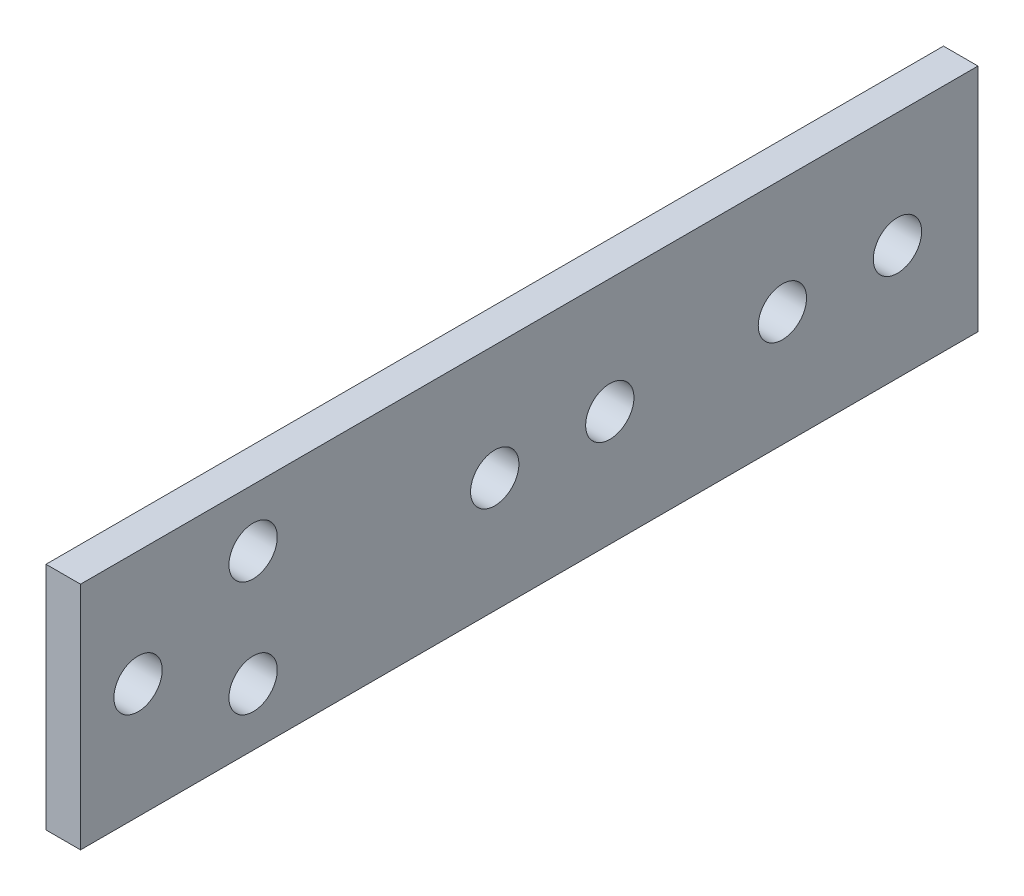
ISO-10303-21;
HEADER;
FILE_DESCRIPTION(('STEP AP214'),'2;1');
FILE_NAME('part.step','',(''),(''),'','','');
FILE_SCHEMA(('AUTOMOTIVE_DESIGN { 1 0 10303 214 1 1 1 1 }'));
ENDSEC;
DATA;
#1=APPLICATION_CONTEXT('core data for automotive mechanical design processes');
#2=APPLICATION_PROTOCOL_DEFINITION('international standard','automotive_design',2000,#1);
#3=PRODUCT_CONTEXT('',#1,'mechanical');
#4=PRODUCT('Part','Part','',(#3));
#5=PRODUCT_RELATED_PRODUCT_CATEGORY('part','',(#4));
#6=PRODUCT_DEFINITION_FORMATION('','',#4);
#7=PRODUCT_DEFINITION_CONTEXT('part definition',#1,'design');
#8=PRODUCT_DEFINITION('design','',#6,#7);
#9=PRODUCT_DEFINITION_SHAPE('','',#8);
#10=(LENGTH_UNIT() NAMED_UNIT(*) SI_UNIT(.MILLI.,.METRE.));
#11=(NAMED_UNIT(*) PLANE_ANGLE_UNIT() SI_UNIT($,.RADIAN.));
#12=(NAMED_UNIT(*) SI_UNIT($,.STERADIAN.) SOLID_ANGLE_UNIT());
#13=UNCERTAINTY_MEASURE_WITH_UNIT(LENGTH_MEASURE(1.E-05),#10,'distance_accuracy_value','');
#14=(GEOMETRIC_REPRESENTATION_CONTEXT(3) GLOBAL_UNCERTAINTY_ASSIGNED_CONTEXT((#13)) GLOBAL_UNIT_ASSIGNED_CONTEXT((#10,
#11,#12)) REPRESENTATION_CONTEXT('',''));
#15=CARTESIAN_POINT('',(0.,0.,0.));
#16=DIRECTION('',(0.,0.,1.));
#17=DIRECTION('',(1.,0.,0.));
#18=AXIS2_PLACEMENT_3D('',#15,#16,#17);
#19=CARTESIAN_POINT('',(33.,-80.,-58.));
#20=DIRECTION('',(0.,0.,-1.));
#21=DIRECTION('',(-1.,0.,0.));
#22=AXIS2_PLACEMENT_3D('',#19,#20,#21);
#23=PLANE('',#22);
#24=DIRECTION('',(0.,1.,0.));
#25=VECTOR('',#24,1.);
#26=CARTESIAN_POINT('',(36.,-80.,-58.));
#27=LINE('',#26,#25);
#28=CARTESIAN_POINT('',(36.,-80.,-58.));
#29=VERTEX_POINT('',#28);
#30=CARTESIAN_POINT('',(36.,-60.,-58.));
#31=VERTEX_POINT('',#30);
#32=EDGE_CURVE('E97',#29,#31,#27,.T.);
#33=ORIENTED_EDGE('',*,*,#32,.F.);
#34=DIRECTION('',(1.,0.,0.));
#35=VECTOR('',#34,1.);
#36=CARTESIAN_POINT('',(33.,-80.,-58.));
#37=LINE('',#36,#35);
#38=CARTESIAN_POINT('',(33.,-80.,-58.));
#39=VERTEX_POINT('',#38);
#40=EDGE_CURVE('E11',#39,#29,#37,.T.);
#41=ORIENTED_EDGE('',*,*,#40,.F.);
#42=DIRECTION('',(0.,1.,0.));
#43=VECTOR('',#42,1.);
#44=CARTESIAN_POINT('',(33.,-80.,-58.));
#45=LINE('',#44,#43);
#46=CARTESIAN_POINT('',(33.,-60.,-58.));
#47=VERTEX_POINT('',#46);
#48=EDGE_CURVE('E90',#39,#47,#45,.T.);
#49=ORIENTED_EDGE('',*,*,#48,.T.);
#50=DIRECTION('',(1.,0.,0.));
#51=VECTOR('',#50,1.);
#52=CARTESIAN_POINT('',(33.,-60.,-58.));
#53=LINE('',#52,#51);
#54=EDGE_CURVE('E35',#47,#31,#53,.T.);
#55=ORIENTED_EDGE('',*,*,#54,.T.);
#56=EDGE_LOOP('',(#33,#41,#49,#55));
#57=FACE_BOUND('',#56,.T.);
#58=ADVANCED_FACE('F32',(#57),#23,.T.);
#59=CARTESIAN_POINT('',(33.,-80.,20.));
#60=DIRECTION('',(0.,-1.,0.));
#61=DIRECTION('',(0.,0.,-1.));
#62=AXIS2_PLACEMENT_3D('',#59,#60,#61);
#63=PLANE('',#62);
#64=DIRECTION('',(0.,0.,-1.));
#65=VECTOR('',#64,1.);
#66=CARTESIAN_POINT('',(36.,-80.,20.));
#67=LINE('',#66,#65);
#68=CARTESIAN_POINT('',(36.,-80.,20.));
#69=VERTEX_POINT('',#68);
#70=EDGE_CURVE('E92',#69,#29,#67,.T.);
#71=ORIENTED_EDGE('',*,*,#70,.F.);
#72=DIRECTION('',(1.,0.,0.));
#73=VECTOR('',#72,1.);
#74=CARTESIAN_POINT('',(33.,-80.,20.));
#75=LINE('',#74,#73);
#76=CARTESIAN_POINT('',(33.,-80.,20.));
#77=VERTEX_POINT('',#76);
#78=EDGE_CURVE('E41',#77,#69,#75,.T.);
#79=ORIENTED_EDGE('',*,*,#78,.F.);
#80=DIRECTION('',(0.,0.,-1.));
#81=VECTOR('',#80,1.);
#82=CARTESIAN_POINT('',(33.,-80.,20.));
#83=LINE('',#82,#81);
#84=EDGE_CURVE('E87',#77,#39,#83,.T.);
#85=ORIENTED_EDGE('',*,*,#84,.T.);
#86=ORIENTED_EDGE('',*,*,#40,.T.);
#87=EDGE_LOOP('',(#71,#79,#85,#86));
#88=FACE_BOUND('',#87,.T.);
#89=ADVANCED_FACE('F108',(#88),#63,.T.);
#90=CARTESIAN_POINT('',(33.,-60.,20.));
#91=DIRECTION('',(0.,0.,1.));
#92=DIRECTION('',(1.,0.,0.));
#93=AXIS2_PLACEMENT_3D('',#90,#91,#92);
#94=PLANE('',#93);
#95=DIRECTION('',(0.,-1.,0.));
#96=VECTOR('',#95,1.);
#97=CARTESIAN_POINT('',(36.,-60.,20.));
#98=LINE('',#97,#96);
#99=CARTESIAN_POINT('',(36.,-60.,20.));
#100=VERTEX_POINT('',#99);
#101=EDGE_CURVE('E82',#100,#69,#98,.T.);
#102=ORIENTED_EDGE('',*,*,#101,.F.);
#103=DIRECTION('',(1.,0.,0.));
#104=VECTOR('',#103,1.);
#105=CARTESIAN_POINT('',(33.,-60.,20.));
#106=LINE('',#105,#104);
#107=CARTESIAN_POINT('',(33.,-60.,20.));
#108=VERTEX_POINT('',#107);
#109=EDGE_CURVE('E77',#108,#100,#106,.T.);
#110=ORIENTED_EDGE('',*,*,#109,.F.);
#111=DIRECTION('',(0.,-1.,0.));
#112=VECTOR('',#111,1.);
#113=CARTESIAN_POINT('',(33.,-60.,20.));
#114=LINE('',#113,#112);
#115=EDGE_CURVE('E80',#108,#77,#114,.T.);
#116=ORIENTED_EDGE('',*,*,#115,.T.);
#117=ORIENTED_EDGE('',*,*,#78,.T.);
#118=EDGE_LOOP('',(#102,#110,#116,#117));
#119=FACE_BOUND('',#118,.T.);
#120=ADVANCED_FACE('F79',(#119),#94,.T.);
#121=CARTESIAN_POINT('',(33.,-60.,-58.));
#122=DIRECTION('',(0.,1.,0.));
#123=DIRECTION('',(0.,0.,1.));
#124=AXIS2_PLACEMENT_3D('',#121,#122,#123);
#125=PLANE('',#124);
#126=DIRECTION('',(0.,0.,1.));
#127=VECTOR('',#126,1.);
#128=CARTESIAN_POINT('',(36.,-60.,-58.));
#129=LINE('',#128,#127);
#130=EDGE_CURVE('E100',#31,#100,#129,.T.);
#131=ORIENTED_EDGE('',*,*,#130,.F.);
#132=ORIENTED_EDGE('',*,*,#54,.F.);
#133=DIRECTION('',(0.,0.,1.));
#134=VECTOR('',#133,1.);
#135=CARTESIAN_POINT('',(33.,-60.,-58.));
#136=LINE('',#135,#134);
#137=EDGE_CURVE('E86',#47,#108,#136,.T.);
#138=ORIENTED_EDGE('',*,*,#137,.T.);
#139=ORIENTED_EDGE('',*,*,#109,.T.);
#140=EDGE_LOOP('',(#131,#132,#138,#139));
#141=FACE_BOUND('',#140,.T.);
#142=ADVANCED_FACE('F89',(#141),#125,.T.);
#143=CARTESIAN_POINT('',(33.,0.,0.));
#144=DIRECTION('',(1.,0.,0.));
#145=DIRECTION('',(0.,0.,-1.));
#146=AXIS2_PLACEMENT_3D('',#143,#144,#145);
#147=PLANE('',#146);
#148=CARTESIAN_POINT('',(33.,-75.,5.00000000000001));
#149=DIRECTION('',(1.,0.,0.));
#150=DIRECTION('',(0.,0.,1.));
#151=AXIS2_PLACEMENT_3D('',#148,#149,#150);
#152=CIRCLE('',#151,2.1);
#153=CARTESIAN_POINT('',(33.,-75.,7.10000000000001));
#154=VERTEX_POINT('',#153);
#155=EDGE_CURVE('E161',#154,#154,#152,.T.);
#156=ORIENTED_EDGE('',*,*,#155,.T.);
#157=EDGE_LOOP('',(#156));
#158=FACE_BOUND('',#157,.T.);
#159=CARTESIAN_POINT('',(33.,-65.,5.00000000000002));
#160=DIRECTION('',(1.,0.,0.));
#161=DIRECTION('',(0.,0.,1.));
#162=AXIS2_PLACEMENT_3D('',#159,#160,#161);
#163=CIRCLE('',#162,2.1);
#164=CARTESIAN_POINT('',(33.,-65.,7.10000000000002));
#165=VERTEX_POINT('',#164);
#166=EDGE_CURVE('E169',#165,#165,#163,.T.);
#167=ORIENTED_EDGE('',*,*,#166,.T.);
#168=EDGE_LOOP('',(#167));
#169=FACE_BOUND('',#168,.T.);
#170=CARTESIAN_POINT('',(33.,-70.,-16.));
#171=DIRECTION('',(1.,0.,0.));
#172=DIRECTION('',(0.,0.,1.));
#173=AXIS2_PLACEMENT_3D('',#170,#171,#172);
#174=CIRCLE('',#173,2.1);
#175=CARTESIAN_POINT('',(33.,-70.,-13.9));
#176=VERTEX_POINT('',#175);
#177=EDGE_CURVE('E175',#176,#176,#174,.T.);
#178=ORIENTED_EDGE('',*,*,#177,.T.);
#179=EDGE_LOOP('',(#178));
#180=FACE_BOUND('',#179,.T.);
#181=CARTESIAN_POINT('',(33.,-70.,-26.));
#182=DIRECTION('',(1.,0.,0.));
#183=DIRECTION('',(0.,0.,1.));
#184=AXIS2_PLACEMENT_3D('',#181,#182,#183);
#185=CIRCLE('',#184,2.1);
#186=CARTESIAN_POINT('',(33.,-70.,-23.9));
#187=VERTEX_POINT('',#186);
#188=EDGE_CURVE('E181',#187,#187,#185,.T.);
#189=ORIENTED_EDGE('',*,*,#188,.T.);
#190=EDGE_LOOP('',(#189));
#191=FACE_BOUND('',#190,.T.);
#192=CARTESIAN_POINT('',(33.,-70.,-51.));
#193=DIRECTION('',(1.,0.,0.));
#194=DIRECTION('',(0.,0.,1.));
#195=AXIS2_PLACEMENT_3D('',#192,#193,#194);
#196=CIRCLE('',#195,2.1);
#197=CARTESIAN_POINT('',(33.,-70.,-48.9));
#198=VERTEX_POINT('',#197);
#199=EDGE_CURVE('E187',#198,#198,#196,.T.);
#200=ORIENTED_EDGE('',*,*,#199,.T.);
#201=EDGE_LOOP('',(#200));
#202=FACE_BOUND('',#201,.T.);
#203=CARTESIAN_POINT('',(33.,-70.,-41.));
#204=DIRECTION('',(1.,0.,0.));
#205=DIRECTION('',(0.,0.,1.));
#206=AXIS2_PLACEMENT_3D('',#203,#204,#205);
#207=CIRCLE('',#206,2.1);
#208=CARTESIAN_POINT('',(33.,-70.,-38.9));
#209=VERTEX_POINT('',#208);
#210=EDGE_CURVE('E193',#209,#209,#207,.T.);
#211=ORIENTED_EDGE('',*,*,#210,.T.);
#212=EDGE_LOOP('',(#211));
#213=FACE_BOUND('',#212,.T.);
#214=CARTESIAN_POINT('',(33.,-70.,15.));
#215=DIRECTION('',(1.,0.,0.));
#216=DIRECTION('',(0.,0.,1.));
#217=AXIS2_PLACEMENT_3D('',#214,#215,#216);
#218=CIRCLE('',#217,2.1);
#219=CARTESIAN_POINT('',(33.,-70.,17.1));
#220=VERTEX_POINT('',#219);
#221=EDGE_CURVE('E101',#220,#220,#218,.T.);
#222=ORIENTED_EDGE('',*,*,#221,.T.);
#223=EDGE_LOOP('',(#222));
#224=FACE_BOUND('',#223,.T.);
#225=ORIENTED_EDGE('',*,*,#48,.F.);
#226=ORIENTED_EDGE('',*,*,#84,.F.);
#227=ORIENTED_EDGE('',*,*,#115,.F.);
#228=ORIENTED_EDGE('',*,*,#137,.F.);
#229=EDGE_LOOP('',(#225,#226,#227,#228));
#230=FACE_BOUND('',#229,.T.);
#231=ADVANCED_FACE('F85',(#158,#169,#180,#191,#202,#213,#224,#230),#147,.F.);
#232=CARTESIAN_POINT('',(36.,0.,0.));
#233=DIRECTION('',(1.,0.,0.));
#234=DIRECTION('',(0.,0.,-1.));
#235=AXIS2_PLACEMENT_3D('',#232,#233,#234);
#236=PLANE('',#235);
#237=CARTESIAN_POINT('',(36.,-75.,5.00000000000001));
#238=DIRECTION('',(1.,0.,0.));
#239=DIRECTION('',(0.,0.,1.));
#240=AXIS2_PLACEMENT_3D('',#237,#238,#239);
#241=CIRCLE('',#240,2.1);
#242=CARTESIAN_POINT('',(36.,-75.,7.10000000000001));
#243=VERTEX_POINT('',#242);
#244=EDGE_CURVE('E164',#243,#243,#241,.T.);
#245=ORIENTED_EDGE('',*,*,#244,.F.);
#246=EDGE_LOOP('',(#245));
#247=FACE_BOUND('',#246,.T.);
#248=CARTESIAN_POINT('',(36.,-65.,5.00000000000002));
#249=DIRECTION('',(1.,0.,0.));
#250=DIRECTION('',(0.,0.,1.));
#251=AXIS2_PLACEMENT_3D('',#248,#249,#250);
#252=CIRCLE('',#251,2.1);
#253=CARTESIAN_POINT('',(36.,-65.,7.10000000000002));
#254=VERTEX_POINT('',#253);
#255=EDGE_CURVE('E166',#254,#254,#252,.T.);
#256=ORIENTED_EDGE('',*,*,#255,.F.);
#257=EDGE_LOOP('',(#256));
#258=FACE_BOUND('',#257,.T.);
#259=CARTESIAN_POINT('',(36.,-70.,-16.));
#260=DIRECTION('',(1.,0.,0.));
#261=DIRECTION('',(0.,0.,1.));
#262=AXIS2_PLACEMENT_3D('',#259,#260,#261);
#263=CIRCLE('',#262,2.1);
#264=CARTESIAN_POINT('',(36.,-70.,-13.9));
#265=VERTEX_POINT('',#264);
#266=EDGE_CURVE('E172',#265,#265,#263,.T.);
#267=ORIENTED_EDGE('',*,*,#266,.F.);
#268=EDGE_LOOP('',(#267));
#269=FACE_BOUND('',#268,.T.);
#270=CARTESIAN_POINT('',(36.,-70.,-26.));
#271=DIRECTION('',(1.,0.,0.));
#272=DIRECTION('',(0.,0.,1.));
#273=AXIS2_PLACEMENT_3D('',#270,#271,#272);
#274=CIRCLE('',#273,2.1);
#275=CARTESIAN_POINT('',(36.,-70.,-23.9));
#276=VERTEX_POINT('',#275);
#277=EDGE_CURVE('E178',#276,#276,#274,.T.);
#278=ORIENTED_EDGE('',*,*,#277,.F.);
#279=EDGE_LOOP('',(#278));
#280=FACE_BOUND('',#279,.T.);
#281=CARTESIAN_POINT('',(36.,-70.,-51.));
#282=DIRECTION('',(1.,0.,0.));
#283=DIRECTION('',(0.,0.,1.));
#284=AXIS2_PLACEMENT_3D('',#281,#282,#283);
#285=CIRCLE('',#284,2.1);
#286=CARTESIAN_POINT('',(36.,-70.,-48.9));
#287=VERTEX_POINT('',#286);
#288=EDGE_CURVE('E184',#287,#287,#285,.T.);
#289=ORIENTED_EDGE('',*,*,#288,.F.);
#290=EDGE_LOOP('',(#289));
#291=FACE_BOUND('',#290,.T.);
#292=CARTESIAN_POINT('',(36.,-70.,-41.));
#293=DIRECTION('',(1.,0.,0.));
#294=DIRECTION('',(0.,0.,1.));
#295=AXIS2_PLACEMENT_3D('',#292,#293,#294);
#296=CIRCLE('',#295,2.1);
#297=CARTESIAN_POINT('',(36.,-70.,-38.9));
#298=VERTEX_POINT('',#297);
#299=EDGE_CURVE('E190',#298,#298,#296,.T.);
#300=ORIENTED_EDGE('',*,*,#299,.F.);
#301=EDGE_LOOP('',(#300));
#302=FACE_BOUND('',#301,.T.);
#303=CARTESIAN_POINT('',(36.,-70.,15.));
#304=DIRECTION('',(1.,0.,0.));
#305=DIRECTION('',(0.,0.,1.));
#306=AXIS2_PLACEMENT_3D('',#303,#304,#305);
#307=CIRCLE('',#306,2.1);
#308=CARTESIAN_POINT('',(36.,-70.,17.1));
#309=VERTEX_POINT('',#308);
#310=EDGE_CURVE('E196',#309,#309,#307,.T.);
#311=ORIENTED_EDGE('',*,*,#310,.F.);
#312=EDGE_LOOP('',(#311));
#313=FACE_BOUND('',#312,.T.);
#314=ORIENTED_EDGE('',*,*,#32,.T.);
#315=ORIENTED_EDGE('',*,*,#130,.T.);
#316=ORIENTED_EDGE('',*,*,#101,.T.);
#317=ORIENTED_EDGE('',*,*,#70,.T.);
#318=EDGE_LOOP('',(#314,#315,#316,#317));
#319=FACE_BOUND('',#318,.T.);
#320=ADVANCED_FACE('F107',(#247,#258,#269,#280,#291,#302,#313,#319),#236,.T.);
#321=CARTESIAN_POINT('',(33.,-70.,15.));
#322=DIRECTION('',(1.,0.,0.));
#323=DIRECTION('',(0.,0.,-1.));
#324=AXIS2_PLACEMENT_3D('',#321,#322,#323);
#325=CYLINDRICAL_SURFACE('',#324,2.1);
#326=ORIENTED_EDGE('',*,*,#221,.F.);
#327=EDGE_LOOP('',(#326));
#328=FACE_BOUND('',#327,.T.);
#329=ORIENTED_EDGE('',*,*,#310,.T.);
#330=EDGE_LOOP('',(#329));
#331=FACE_BOUND('',#330,.T.);
#332=ADVANCED_FACE('F126',(#328,#331),#325,.F.);
#333=CARTESIAN_POINT('',(33.,-70.,-41.));
#334=DIRECTION('',(1.,0.,0.));
#335=DIRECTION('',(0.,0.,-1.));
#336=AXIS2_PLACEMENT_3D('',#333,#334,#335);
#337=CYLINDRICAL_SURFACE('',#336,2.1);
#338=ORIENTED_EDGE('',*,*,#210,.F.);
#339=EDGE_LOOP('',(#338));
#340=FACE_BOUND('',#339,.T.);
#341=ORIENTED_EDGE('',*,*,#299,.T.);
#342=EDGE_LOOP('',(#341));
#343=FACE_BOUND('',#342,.T.);
#344=ADVANCED_FACE('F133',(#340,#343),#337,.F.);
#345=CARTESIAN_POINT('',(33.,-70.,-51.));
#346=DIRECTION('',(1.,0.,0.));
#347=DIRECTION('',(0.,0.,-1.));
#348=AXIS2_PLACEMENT_3D('',#345,#346,#347);
#349=CYLINDRICAL_SURFACE('',#348,2.1);
#350=ORIENTED_EDGE('',*,*,#199,.F.);
#351=EDGE_LOOP('',(#350));
#352=FACE_BOUND('',#351,.T.);
#353=ORIENTED_EDGE('',*,*,#288,.T.);
#354=EDGE_LOOP('',(#353));
#355=FACE_BOUND('',#354,.T.);
#356=ADVANCED_FACE('F137',(#352,#355),#349,.F.);
#357=CARTESIAN_POINT('',(33.,-70.,-26.));
#358=DIRECTION('',(1.,0.,0.));
#359=DIRECTION('',(0.,0.,-1.));
#360=AXIS2_PLACEMENT_3D('',#357,#358,#359);
#361=CYLINDRICAL_SURFACE('',#360,2.1);
#362=ORIENTED_EDGE('',*,*,#188,.F.);
#363=EDGE_LOOP('',(#362));
#364=FACE_BOUND('',#363,.T.);
#365=ORIENTED_EDGE('',*,*,#277,.T.);
#366=EDGE_LOOP('',(#365));
#367=FACE_BOUND('',#366,.T.);
#368=ADVANCED_FACE('F141',(#364,#367),#361,.F.);
#369=CARTESIAN_POINT('',(33.,-70.,-16.));
#370=DIRECTION('',(1.,0.,0.));
#371=DIRECTION('',(0.,0.,-1.));
#372=AXIS2_PLACEMENT_3D('',#369,#370,#371);
#373=CYLINDRICAL_SURFACE('',#372,2.1);
#374=ORIENTED_EDGE('',*,*,#177,.F.);
#375=EDGE_LOOP('',(#374));
#376=FACE_BOUND('',#375,.T.);
#377=ORIENTED_EDGE('',*,*,#266,.T.);
#378=EDGE_LOOP('',(#377));
#379=FACE_BOUND('',#378,.T.);
#380=ADVANCED_FACE('F145',(#376,#379),#373,.F.);
#381=CARTESIAN_POINT('',(33.,-65.,5.00000000000002));
#382=DIRECTION('',(1.,0.,0.));
#383=DIRECTION('',(0.,0.,-1.));
#384=AXIS2_PLACEMENT_3D('',#381,#382,#383);
#385=CYLINDRICAL_SURFACE('',#384,2.1);
#386=ORIENTED_EDGE('',*,*,#166,.F.);
#387=EDGE_LOOP('',(#386));
#388=FACE_BOUND('',#387,.T.);
#389=ORIENTED_EDGE('',*,*,#255,.T.);
#390=EDGE_LOOP('',(#389));
#391=FACE_BOUND('',#390,.T.);
#392=ADVANCED_FACE('F149',(#388,#391),#385,.F.);
#393=CARTESIAN_POINT('',(33.,-75.,5.00000000000001));
#394=DIRECTION('',(1.,0.,0.));
#395=DIRECTION('',(0.,0.,-1.));
#396=AXIS2_PLACEMENT_3D('',#393,#394,#395);
#397=CYLINDRICAL_SURFACE('',#396,2.1);
#398=ORIENTED_EDGE('',*,*,#155,.F.);
#399=EDGE_LOOP('',(#398));
#400=FACE_BOUND('',#399,.T.);
#401=ORIENTED_EDGE('',*,*,#244,.T.);
#402=EDGE_LOOP('',(#401));
#403=FACE_BOUND('',#402,.T.);
#404=ADVANCED_FACE('F153',(#400,#403),#397,.F.);
#405=CLOSED_SHELL('',(#58,#89,#120,#142,#231,#320,#332,#344,#356,#368,#380,#392,#404));
#406=MANIFOLD_SOLID_BREP('B2',#405);
#407=ADVANCED_BREP_SHAPE_REPRESENTATION('',(#18,#406),#14);
#408=SHAPE_DEFINITION_REPRESENTATION(#9,#407);
ENDSEC;
END-ISO-10303-21;
